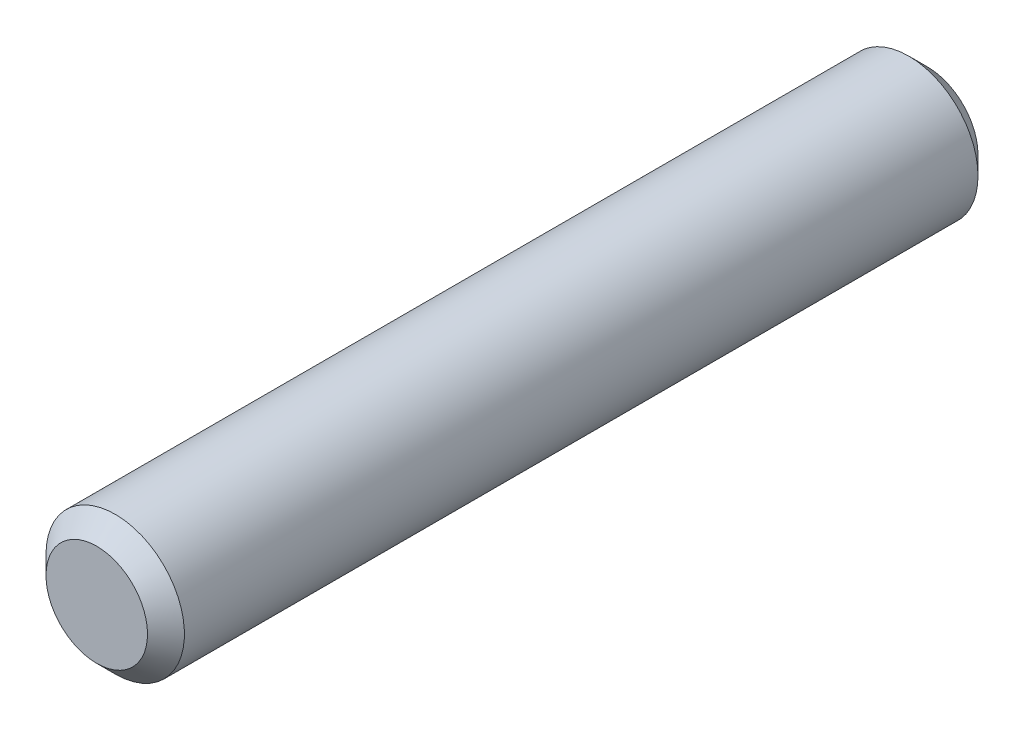
ISO-10303-21;
HEADER;
FILE_DESCRIPTION(('STEP AP214'),'2;1');
FILE_NAME('part.step','',(''),(''),'','','');
FILE_SCHEMA(('AUTOMOTIVE_DESIGN { 1 0 10303 214 1 1 1 1 }'));
ENDSEC;
DATA;
#1=APPLICATION_CONTEXT('core data for automotive mechanical design processes');
#2=APPLICATION_PROTOCOL_DEFINITION('international standard','automotive_design',2000,#1);
#3=PRODUCT_CONTEXT('',#1,'mechanical');
#4=PRODUCT('Part','Part','',(#3));
#5=PRODUCT_RELATED_PRODUCT_CATEGORY('part','',(#4));
#6=PRODUCT_DEFINITION_FORMATION('','',#4);
#7=PRODUCT_DEFINITION_CONTEXT('part definition',#1,'design');
#8=PRODUCT_DEFINITION('design','',#6,#7);
#9=PRODUCT_DEFINITION_SHAPE('','',#8);
#10=(LENGTH_UNIT() NAMED_UNIT(*) SI_UNIT(.MILLI.,.METRE.));
#11=(NAMED_UNIT(*) PLANE_ANGLE_UNIT() SI_UNIT($,.RADIAN.));
#12=(NAMED_UNIT(*) SI_UNIT($,.STERADIAN.) SOLID_ANGLE_UNIT());
#13=UNCERTAINTY_MEASURE_WITH_UNIT(LENGTH_MEASURE(1.E-05),#10,'distance_accuracy_value','');
#14=(GEOMETRIC_REPRESENTATION_CONTEXT(3) GLOBAL_UNCERTAINTY_ASSIGNED_CONTEXT((#13)) GLOBAL_UNIT_ASSIGNED_CONTEXT((#10,
#11,#12)) REPRESENTATION_CONTEXT('',''));
#15=CARTESIAN_POINT('',(0.,0.,0.));
#16=DIRECTION('',(0.,0.,1.));
#17=DIRECTION('',(1.,0.,0.));
#18=AXIS2_PLACEMENT_3D('',#15,#16,#17);
#19=CARTESIAN_POINT('',(0.,0.,90.));
#20=DIRECTION('',(0.,0.,-1.));
#21=DIRECTION('',(-1.,0.,0.));
#22=AXIS2_PLACEMENT_3D('',#19,#20,#21);
#23=CYLINDRICAL_SURFACE('',#22,7.5);
#24=CARTESIAN_POINT('',(0.,0.,88.));
#25=DIRECTION('',(0.,0.,1.));
#26=DIRECTION('',(1.,0.,0.));
#27=AXIS2_PLACEMENT_3D('',#24,#25,#26);
#28=CIRCLE('',#27,7.5);
#29=CARTESIAN_POINT('',(-7.5,0.,88.));
#30=VERTEX_POINT('',#29);
#31=EDGE_CURVE('E45',#30,#30,#28,.F.);
#32=CARTESIAN_POINT('',(0.,0.,2.00000000000011));
#33=DIRECTION('',(0.,0.,1.));
#34=DIRECTION('',(1.,0.,0.));
#35=AXIS2_PLACEMENT_3D('',#32,#33,#34);
#36=CIRCLE('',#35,7.5);
#37=CARTESIAN_POINT('',(-7.5,0.,2.0000000000001));
#38=VERTEX_POINT('',#37);
#39=EDGE_CURVE('E50',#38,#38,#36,.T.);
#40=CARTESIAN_POINT('',(-7.5,0.,88.));
#41=CARTESIAN_POINT('',(-7.5,0.,87.1041666666667));
#42=CARTESIAN_POINT('',(-7.5,0.,86.2083333333333));
#43=CARTESIAN_POINT('',(-7.5,0.,84.4166666666667));
#44=CARTESIAN_POINT('',(-7.5,0.,83.5208333333333));
#45=CARTESIAN_POINT('',(-7.5,0.,81.7291666666667));
#46=CARTESIAN_POINT('',(-7.5,0.,80.8333333333334));
#47=CARTESIAN_POINT('',(-7.5,0.,79.0416666666667));
#48=CARTESIAN_POINT('',(-7.5,0.,78.1458333333334));
#49=CARTESIAN_POINT('',(-7.5,0.,76.3541666666667));
#50=CARTESIAN_POINT('',(-7.5,0.,75.4583333333334));
#51=CARTESIAN_POINT('',(-7.5,0.,73.6666666666667));
#52=CARTESIAN_POINT('',(-7.5,0.,72.7708333333334));
#53=CARTESIAN_POINT('',(-7.5,0.,70.9791666666667));
#54=CARTESIAN_POINT('',(-7.5,0.,70.0833333333334));
#55=CARTESIAN_POINT('',(-7.5,0.,68.2916666666667));
#56=CARTESIAN_POINT('',(-7.5,0.,67.3958333333334));
#57=CARTESIAN_POINT('',(-7.5,0.,65.6041666666667));
#58=CARTESIAN_POINT('',(-7.5,0.,64.7083333333334));
#59=CARTESIAN_POINT('',(-7.5,0.,62.9166666666667));
#60=CARTESIAN_POINT('',(-7.5,0.,62.0208333333334));
#61=CARTESIAN_POINT('',(-7.5,0.,60.2291666666667));
#62=CARTESIAN_POINT('',(-7.5,0.,59.3333333333334));
#63=CARTESIAN_POINT('',(-7.5,0.,57.5416666666667));
#64=CARTESIAN_POINT('',(-7.5,0.,56.6458333333334));
#65=CARTESIAN_POINT('',(-7.5,0.,54.8541666666667));
#66=CARTESIAN_POINT('',(-7.5,0.,53.9583333333334));
#67=CARTESIAN_POINT('',(-7.5,0.,52.1666666666667));
#68=CARTESIAN_POINT('',(-7.5,0.,51.2708333333334));
#69=CARTESIAN_POINT('',(-7.5,0.,49.4791666666667));
#70=CARTESIAN_POINT('',(-7.5,0.,48.5833333333334));
#71=CARTESIAN_POINT('',(-7.5,0.,46.7916666666667));
#72=CARTESIAN_POINT('',(-7.5,0.,45.8958333333334));
#73=CARTESIAN_POINT('',(-7.5,0.,44.1041666666667));
#74=CARTESIAN_POINT('',(-7.5,0.,43.2083333333334));
#75=CARTESIAN_POINT('',(-7.5,0.,41.4166666666667));
#76=CARTESIAN_POINT('',(-7.5,0.,40.5208333333334));
#77=CARTESIAN_POINT('',(-7.5,0.,38.7291666666667));
#78=CARTESIAN_POINT('',(-7.5,0.,37.8333333333334));
#79=CARTESIAN_POINT('',(-7.5,0.,36.0416666666667));
#80=CARTESIAN_POINT('',(-7.5,0.,35.1458333333334));
#81=CARTESIAN_POINT('',(-7.5,0.,33.3541666666667));
#82=CARTESIAN_POINT('',(-7.5,0.,32.4583333333334));
#83=CARTESIAN_POINT('',(-7.5,0.,30.6666666666667));
#84=CARTESIAN_POINT('',(-7.5,0.,29.7708333333334));
#85=CARTESIAN_POINT('',(-7.5,0.,27.9791666666667));
#86=CARTESIAN_POINT('',(-7.5,0.,27.0833333333334));
#87=CARTESIAN_POINT('',(-7.5,0.,25.2916666666667));
#88=CARTESIAN_POINT('',(-7.5,0.,24.3958333333334));
#89=CARTESIAN_POINT('',(-7.5,0.,22.6041666666667));
#90=CARTESIAN_POINT('',(-7.5,0.,21.7083333333334));
#91=CARTESIAN_POINT('',(-7.5,0.,19.9166666666667));
#92=CARTESIAN_POINT('',(-7.5,0.,19.0208333333334));
#93=CARTESIAN_POINT('',(-7.5,0.,17.2291666666668));
#94=CARTESIAN_POINT('',(-7.5,0.,16.3333333333334));
#95=CARTESIAN_POINT('',(-7.5,0.,14.5416666666668));
#96=CARTESIAN_POINT('',(-7.5,0.,13.6458333333334));
#97=CARTESIAN_POINT('',(-7.5,0.,11.8541666666668));
#98=CARTESIAN_POINT('',(-7.5,0.,10.9583333333334));
#99=CARTESIAN_POINT('',(-7.5,0.,9.16666666666675));
#100=CARTESIAN_POINT('',(-7.5,0.,8.27083333333342));
#101=CARTESIAN_POINT('',(-7.5,0.,6.47916666666676));
#102=CARTESIAN_POINT('',(-7.5,0.,5.58333333333343));
#103=CARTESIAN_POINT('',(-7.5,0.,3.79166666666676));
#104=CARTESIAN_POINT('',(-7.5,0.,2.89583333333343));
#105=CARTESIAN_POINT('',(-7.5,0.,2.0000000000001));
#106=B_SPLINE_CURVE_WITH_KNOTS('',3,(#40,#41,#42,#43,#44,#45,#46,#47,#48,#49,#50,#51,#52,#53,
#54,#55,#56,#57,#58,#59,#60,#61,#62,#63,#64,#65,#66,#67,#68,#69,#70,#71,#72,#73,#74,#75,#76,#77,
#78,#79,#80,#81,#82,#83,#84,#85,#86,#87,#88,#89,#90,#91,#92,#93,#94,#95,#96,#97,#98,#99,#100,
#101,#102,#103,#104,#105),.UNSPECIFIED.,.F.,.F.,(4,2,2,2,2,2,2,2,2,2,2,2,2,2,2,2,2,2,2,2,2,2,2,
2,2,2,2,2,2,2,2,2,4),(0.,2.6875,5.37499999999999,8.06249999999999,10.75,13.4375,16.125,18.8125,
21.5,24.1875,26.875,29.5625,32.25,34.9375,37.625,40.3125,43.,45.6874999999999,48.3749999999999,
51.0624999999999,53.7499999999999,56.4374999999999,59.1249999999999,61.8124999999999,
64.4999999999999,67.1874999999999,69.8749999999999,72.5624999999999,75.2499999999999,
77.9374999999999,80.6249999999999,83.3124999999999,85.9999999999999),.UNSPECIFIED.);
#107=EDGE_CURVE('BSEAM37',#30,#38,#106,.T.);
#108=ORIENTED_EDGE('',*,*,#31,.T.);
#109=ORIENTED_EDGE('',*,*,#39,.T.);
#110=ORIENTED_EDGE('',*,*,#107,.T.);
#111=ORIENTED_EDGE('',*,*,#107,.F.);
#112=EDGE_LOOP('',(#108,#110,#109,#111));
#113=FACE_BOUND('',#112,.T.);
#114=ADVANCED_FACE('F37',(#113),#23,.T.);
#115=CARTESIAN_POINT('',(0.,0.,90.));
#116=DIRECTION('',(0.,0.,1.));
#117=DIRECTION('',(1.,0.,0.));
#118=AXIS2_PLACEMENT_3D('',#115,#116,#117);
#119=PLANE('',#118);
#120=CARTESIAN_POINT('',(0.,0.,90.));
#121=DIRECTION('',(0.,0.,1.));
#122=DIRECTION('',(1.,0.,0.));
#123=AXIS2_PLACEMENT_3D('',#120,#121,#122);
#124=CIRCLE('',#123,5.50000000000004);
#125=CARTESIAN_POINT('',(5.50000000000004,0.,90.));
#126=VERTEX_POINT('',#125);
#127=EDGE_CURVE('E55',#126,#126,#124,.T.);
#128=ORIENTED_EDGE('',*,*,#127,.T.);
#129=EDGE_LOOP('',(#128));
#130=FACE_BOUND('',#129,.T.);
#131=ADVANCED_FACE('F62',(#130),#119,.T.);
#132=CARTESIAN_POINT('',(0.,0.,0.));
#133=DIRECTION('',(0.,0.,1.));
#134=DIRECTION('',(1.,0.,0.));
#135=AXIS2_PLACEMENT_3D('',#132,#133,#134);
#136=PLANE('',#135);
#137=CARTESIAN_POINT('',(0.,0.,0.));
#138=DIRECTION('',(0.,0.,1.));
#139=DIRECTION('',(1.,0.,0.));
#140=AXIS2_PLACEMENT_3D('',#137,#138,#139);
#141=CIRCLE('',#140,5.49999999999986);
#142=CARTESIAN_POINT('',(5.49999999999986,0.,0.));
#143=VERTEX_POINT('',#142);
#144=EDGE_CURVE('E10',#143,#143,#141,.F.);
#145=ORIENTED_EDGE('',*,*,#144,.T.);
#146=EDGE_LOOP('',(#145));
#147=FACE_BOUND('',#146,.T.);
#148=ADVANCED_FACE('F66',(#147),#136,.F.);
#149=CARTESIAN_POINT('',(0.,0.,90.));
#150=DIRECTION('',(0.,0.,-1.));
#151=DIRECTION('',(-1.,0.,0.));
#152=AXIS2_PLACEMENT_3D('',#149,#150,#151);
#153=CONICAL_SURFACE('',#152,5.50000000000004,0.785398163397444);
#154=ORIENTED_EDGE('',*,*,#31,.F.);
#155=EDGE_LOOP('',(#154));
#156=FACE_BOUND('',#155,.T.);
#157=ORIENTED_EDGE('',*,*,#127,.F.);
#158=EDGE_LOOP('',(#157));
#159=FACE_BOUND('',#158,.T.);
#160=ADVANCED_FACE('F64',(#156,#159),#153,.T.);
#161=CARTESIAN_POINT('',(0.,0.,2.00000000000011));
#162=DIRECTION('',(0.,0.,1.));
#163=DIRECTION('',(1.,0.,0.));
#164=AXIS2_PLACEMENT_3D('',#161,#162,#163);
#165=CONICAL_SURFACE('',#164,7.5,0.785398163397454);
#166=ORIENTED_EDGE('',*,*,#144,.F.);
#167=EDGE_LOOP('',(#166));
#168=FACE_BOUND('',#167,.T.);
#169=ORIENTED_EDGE('',*,*,#39,.F.);
#170=EDGE_LOOP('',(#169));
#171=FACE_BOUND('',#170,.T.);
#172=ADVANCED_FACE('F39',(#168,#171),#165,.T.);
#173=CLOSED_SHELL('',(#114,#131,#148,#160,#172));
#174=MANIFOLD_SOLID_BREP('B2',#173);
#175=ADVANCED_BREP_SHAPE_REPRESENTATION('',(#18,#174),#14);
#176=SHAPE_DEFINITION_REPRESENTATION(#9,#175);
ENDSEC;
END-ISO-10303-21;
